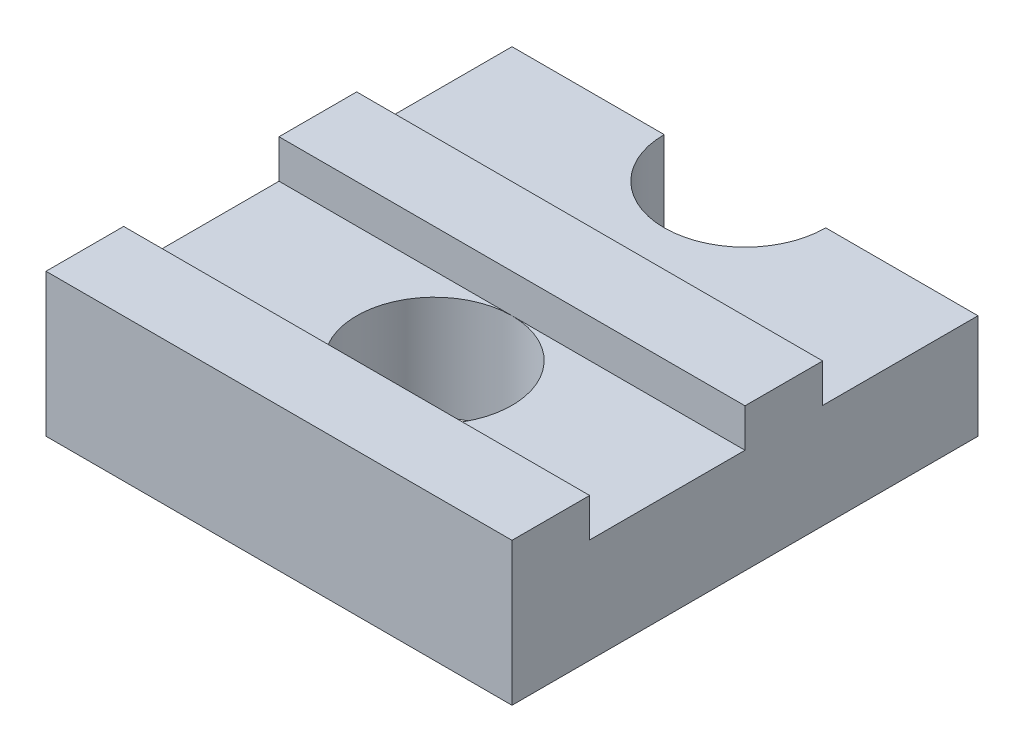
ISO-10303-21;
HEADER;
FILE_DESCRIPTION(('STEP AP214'),'2;1');
FILE_NAME('part.step','',(''),(''),'','','');
FILE_SCHEMA(('AUTOMOTIVE_DESIGN { 1 0 10303 214 1 1 1 1 }'));
ENDSEC;
DATA;
#1=APPLICATION_CONTEXT('core data for automotive mechanical design processes');
#2=APPLICATION_PROTOCOL_DEFINITION('international standard','automotive_design',2000,#1);
#3=PRODUCT_CONTEXT('',#1,'mechanical');
#4=PRODUCT('Part','Part','',(#3));
#5=PRODUCT_RELATED_PRODUCT_CATEGORY('part','',(#4));
#6=PRODUCT_DEFINITION_FORMATION('','',#4);
#7=PRODUCT_DEFINITION_CONTEXT('part definition',#1,'design');
#8=PRODUCT_DEFINITION('design','',#6,#7);
#9=PRODUCT_DEFINITION_SHAPE('','',#8);
#10=(LENGTH_UNIT() NAMED_UNIT(*) SI_UNIT(.MILLI.,.METRE.));
#11=(NAMED_UNIT(*) PLANE_ANGLE_UNIT() SI_UNIT($,.RADIAN.));
#12=(NAMED_UNIT(*) SI_UNIT($,.STERADIAN.) SOLID_ANGLE_UNIT());
#13=UNCERTAINTY_MEASURE_WITH_UNIT(LENGTH_MEASURE(1.E-05),#10,'distance_accuracy_value','');
#14=(GEOMETRIC_REPRESENTATION_CONTEXT(3) GLOBAL_UNCERTAINTY_ASSIGNED_CONTEXT((#13)) GLOBAL_UNIT_ASSIGNED_CONTEXT((#10,
#11,#12)) REPRESENTATION_CONTEXT('',''));
#15=CARTESIAN_POINT('',(0.,0.,0.));
#16=DIRECTION('',(0.,0.,1.));
#17=DIRECTION('',(1.,0.,0.));
#18=AXIS2_PLACEMENT_3D('',#15,#16,#17);
#19=CARTESIAN_POINT('',(4.7625,2.921,-4.7625));
#20=DIRECTION('',(0.,0.,1.));
#21=DIRECTION('',(1.,0.,0.));
#22=AXIS2_PLACEMENT_3D('',#19,#20,#21);
#23=PLANE('',#22);
#24=DIRECTION('',(-1.,0.,0.));
#25=VECTOR('',#24,1.);
#26=CARTESIAN_POINT('',(4.7625,0.,-4.7625));
#27=LINE('',#26,#25);
#28=CARTESIAN_POINT('',(4.7625,0.,-4.7625));
#29=VERTEX_POINT('',#28);
#30=CARTESIAN_POINT('',(1.651,0.,-4.7625));
#31=VERTEX_POINT('',#30);
#32=EDGE_CURVE('E139',#29,#31,#27,.T.);
#33=ORIENTED_EDGE('',*,*,#32,.T.);
#34=DIRECTION('',(0.,1.,0.));
#35=VECTOR('',#34,1.);
#36=CARTESIAN_POINT('',(1.651,0.,-4.7625));
#37=LINE('',#36,#35);
#38=CARTESIAN_POINT('',(1.651,2.1336,-4.7625));
#39=VERTEX_POINT('',#38);
#40=EDGE_CURVE('E124',#31,#39,#37,.T.);
#41=ORIENTED_EDGE('',*,*,#40,.T.);
#42=DIRECTION('',(-1.,0.,0.));
#43=VECTOR('',#42,1.);
#44=CARTESIAN_POINT('',(4.7625,2.1336,-4.7625));
#45=LINE('',#44,#43);
#46=CARTESIAN_POINT('',(4.7625,2.1336,-4.7625));
#47=VERTEX_POINT('',#46);
#48=EDGE_CURVE('E189',#47,#39,#45,.T.);
#49=ORIENTED_EDGE('',*,*,#48,.F.);
#50=DIRECTION('',(0.,-1.,0.));
#51=VECTOR('',#50,1.);
#52=CARTESIAN_POINT('',(4.7625,2.921,-4.7625));
#53=LINE('',#52,#51);
#54=EDGE_CURVE('E144',#47,#29,#53,.T.);
#55=ORIENTED_EDGE('',*,*,#54,.T.);
#56=EDGE_LOOP('',(#33,#41,#49,#55));
#57=FACE_BOUND('',#56,.T.);
#58=ADVANCED_FACE('F32',(#57),#23,.F.);
#59=CARTESIAN_POINT('',(0.,2.1336,0.));
#60=DIRECTION('',(0.,1.,0.));
#61=DIRECTION('',(0.,0.,1.));
#62=AXIS2_PLACEMENT_3D('',#59,#60,#61);
#63=PLANE('',#62);
#64=CARTESIAN_POINT('',(0.,2.1336,1.5875));
#65=DIRECTION('',(0.,1.,0.));
#66=DIRECTION('',(0.,0.,1.));
#67=AXIS2_PLACEMENT_3D('',#64,#65,#66);
#68=CIRCLE('',#67,1.5875);
#69=CARTESIAN_POINT('',(0.,2.1336,3.175));
#70=VERTEX_POINT('',#69);
#71=CARTESIAN_POINT('',(0.,2.1336,0.));
#72=VERTEX_POINT('',#71);
#73=EDGE_CURVE('E53',#70,#72,#68,.T.);
#74=ORIENTED_EDGE('',*,*,#73,.F.);
#75=DIRECTION('',(1.,0.,0.));
#76=VECTOR('',#75,1.);
#77=CARTESIAN_POINT('',(4.7625,2.1336,3.175));
#78=LINE('',#77,#76);
#79=CARTESIAN_POINT('',(4.7625,2.1336,3.175));
#80=VERTEX_POINT('',#79);
#81=EDGE_CURVE('E225',#70,#80,#78,.T.);
#82=ORIENTED_EDGE('',*,*,#81,.T.);
#83=DIRECTION('',(0.,0.,-1.));
#84=VECTOR('',#83,1.);
#85=CARTESIAN_POINT('',(4.7625,2.1336,3.175));
#86=LINE('',#85,#84);
#87=CARTESIAN_POINT('',(4.7625,2.1336,0.));
#88=VERTEX_POINT('',#87);
#89=EDGE_CURVE('E220',#80,#88,#86,.T.);
#90=ORIENTED_EDGE('',*,*,#89,.T.);
#91=DIRECTION('',(-1.,0.,0.));
#92=VECTOR('',#91,1.);
#93=CARTESIAN_POINT('',(4.7625,2.1336,0.));
#94=LINE('',#93,#92);
#95=EDGE_CURVE('E209',#88,#72,#94,.T.);
#96=ORIENTED_EDGE('',*,*,#95,.T.);
#97=EDGE_LOOP('',(#74,#82,#90,#96));
#98=FACE_BOUND('',#97,.T.);
#99=ADVANCED_FACE('F247',(#98),#63,.T.);
#100=CARTESIAN_POINT('',(-1.651,2.1336,-4.7625));
#101=VERTEX_POINT('',#100);
#102=CARTESIAN_POINT('',(-4.7625,2.1336,-4.7625));
#103=VERTEX_POINT('',#102);
#104=EDGE_CURVE('E198',#101,#103,#45,.T.);
#105=ORIENTED_EDGE('',*,*,#104,.F.);
#106=DIRECTION('',(0.,1.,0.));
#107=VECTOR('',#106,1.);
#108=CARTESIAN_POINT('',(-1.651,0.,-4.7625));
#109=LINE('',#108,#107);
#110=CARTESIAN_POINT('',(-1.651,0.,-4.7625));
#111=VERTEX_POINT('',#110);
#112=EDGE_CURVE('E47',#111,#101,#109,.T.);
#113=ORIENTED_EDGE('',*,*,#112,.F.);
#114=CARTESIAN_POINT('',(-4.7625,0.,-4.7625));
#115=VERTEX_POINT('',#114);
#116=EDGE_CURVE('E141',#111,#115,#27,.T.);
#117=ORIENTED_EDGE('',*,*,#116,.T.);
#118=DIRECTION('',(0.,-1.,0.));
#119=VECTOR('',#118,1.);
#120=CARTESIAN_POINT('',(-4.7625,2.921,-4.7625));
#121=LINE('',#120,#119);
#122=EDGE_CURVE('E154',#103,#115,#121,.T.);
#123=ORIENTED_EDGE('',*,*,#122,.F.);
#124=EDGE_LOOP('',(#105,#113,#117,#123));
#125=FACE_BOUND('',#124,.T.);
#126=ADVANCED_FACE('F250',(#125),#23,.F.);
#127=CARTESIAN_POINT('',(0.,2.921,0.));
#128=DIRECTION('',(0.,1.,0.));
#129=DIRECTION('',(0.,0.,1.));
#130=AXIS2_PLACEMENT_3D('',#127,#128,#129);
#131=PLANE('',#130);
#132=DIRECTION('',(-1.,0.,0.));
#133=VECTOR('',#132,1.);
#134=CARTESIAN_POINT('',(4.7625,2.921,0.));
#135=LINE('',#134,#133);
#136=CARTESIAN_POINT('',(4.7625,2.921,0.));
#137=VERTEX_POINT('',#136);
#138=CARTESIAN_POINT('',(-4.7625,2.921,0.));
#139=VERTEX_POINT('',#138);
#140=EDGE_CURVE('E213',#137,#139,#135,.T.);
#141=ORIENTED_EDGE('',*,*,#140,.F.);
#142=DIRECTION('',(0.,0.,-1.));
#143=VECTOR('',#142,1.);
#144=CARTESIAN_POINT('',(4.7625,2.921,4.7625));
#145=LINE('',#144,#143);
#146=CARTESIAN_POINT('',(4.7625,2.921,-1.5875));
#147=VERTEX_POINT('',#146);
#148=EDGE_CURVE('E184',#137,#147,#145,.T.);
#149=ORIENTED_EDGE('',*,*,#148,.T.);
#150=DIRECTION('',(1.,0.,0.));
#151=VECTOR('',#150,1.);
#152=CARTESIAN_POINT('',(4.7625,2.921,-1.5875));
#153=LINE('',#152,#151);
#154=CARTESIAN_POINT('',(-4.7625,2.921,-1.5875));
#155=VERTEX_POINT('',#154);
#156=EDGE_CURVE('E193',#155,#147,#153,.T.);
#157=ORIENTED_EDGE('',*,*,#156,.F.);
#158=DIRECTION('',(0.,0.,1.));
#159=VECTOR('',#158,1.);
#160=CARTESIAN_POINT('',(-4.7625,2.921,4.7625));
#161=LINE('',#160,#159);
#162=EDGE_CURVE('E148',#155,#139,#161,.T.);
#163=ORIENTED_EDGE('',*,*,#162,.T.);
#164=EDGE_LOOP('',(#141,#149,#157,#163));
#165=FACE_BOUND('',#164,.T.);
#166=ADVANCED_FACE('F258',(#165),#131,.T.);
#167=CARTESIAN_POINT('',(-4.7625,2.921,4.7625));
#168=DIRECTION('',(1.,0.,0.));
#169=DIRECTION('',(0.,0.,-1.));
#170=AXIS2_PLACEMENT_3D('',#167,#168,#169);
#171=PLANE('',#170);
#172=DIRECTION('',(0.,0.,1.));
#173=VECTOR('',#172,1.);
#174=CARTESIAN_POINT('',(-4.7625,2.1336,3.175));
#175=LINE('',#174,#173);
#176=CARTESIAN_POINT('',(-4.7625,2.1336,0.));
#177=VERTEX_POINT('',#176);
#178=CARTESIAN_POINT('',(-4.7625,2.1336,3.175));
#179=VERTEX_POINT('',#178);
#180=EDGE_CURVE('E215',#177,#179,#175,.T.);
#181=ORIENTED_EDGE('',*,*,#180,.F.);
#182=DIRECTION('',(0.,1.,0.));
#183=VECTOR('',#182,1.);
#184=CARTESIAN_POINT('',(-4.7625,2.1336,0.));
#185=LINE('',#184,#183);
#186=EDGE_CURVE('E176',#177,#139,#185,.T.);
#187=ORIENTED_EDGE('',*,*,#186,.T.);
#188=ORIENTED_EDGE('',*,*,#162,.F.);
#189=DIRECTION('',(0.,1.,0.));
#190=VECTOR('',#189,1.);
#191=CARTESIAN_POINT('',(-4.7625,2.1336,-1.5875));
#192=LINE('',#191,#190);
#193=CARTESIAN_POINT('',(-4.7625,2.1336,-1.5875));
#194=VERTEX_POINT('',#193);
#195=EDGE_CURVE('E186',#194,#155,#192,.T.);
#196=ORIENTED_EDGE('',*,*,#195,.F.);
#197=DIRECTION('',(0.,0.,1.));
#198=VECTOR('',#197,1.);
#199=CARTESIAN_POINT('',(-4.7625,2.1336,-1.5875));
#200=LINE('',#199,#198);
#201=EDGE_CURVE('E195',#103,#194,#200,.T.);
#202=ORIENTED_EDGE('',*,*,#201,.F.);
#203=ORIENTED_EDGE('',*,*,#122,.T.);
#204=DIRECTION('',(0.,0.,1.));
#205=VECTOR('',#204,1.);
#206=CARTESIAN_POINT('',(-4.7625,0.,4.7625));
#207=LINE('',#206,#205);
#208=CARTESIAN_POINT('',(-4.7625,0.,4.7625));
#209=VERTEX_POINT('',#208);
#210=EDGE_CURVE('E172',#115,#209,#207,.T.);
#211=ORIENTED_EDGE('',*,*,#210,.T.);
#212=DIRECTION('',(0.,-1.,0.));
#213=VECTOR('',#212,1.);
#214=CARTESIAN_POINT('',(-4.7625,2.921,4.7625));
#215=LINE('',#214,#213);
#216=CARTESIAN_POINT('',(-4.7625,2.921,4.7625));
#217=VERTEX_POINT('',#216);
#218=EDGE_CURVE('E40',#217,#209,#215,.T.);
#219=ORIENTED_EDGE('',*,*,#218,.F.);
#220=CARTESIAN_POINT('',(-4.7625,2.921,3.175));
#221=VERTEX_POINT('',#220);
#222=EDGE_CURVE('E146',#221,#217,#161,.T.);
#223=ORIENTED_EDGE('',*,*,#222,.F.);
#224=DIRECTION('',(0.,1.,0.));
#225=VECTOR('',#224,1.);
#226=CARTESIAN_POINT('',(-4.7625,2.1336,3.175));
#227=LINE('',#226,#225);
#228=EDGE_CURVE('E206',#179,#221,#227,.T.);
#229=ORIENTED_EDGE('',*,*,#228,.F.);
#230=EDGE_LOOP('',(#181,#187,#188,#196,#202,#203,#211,#219,#223,#229));
#231=FACE_BOUND('',#230,.T.);
#232=ADVANCED_FACE('F34',(#231),#171,.F.);
#233=CARTESIAN_POINT('',(4.7625,2.921,4.7625));
#234=DIRECTION('',(0.,0.,-1.));
#235=DIRECTION('',(-1.,0.,0.));
#236=AXIS2_PLACEMENT_3D('',#233,#234,#235);
#237=PLANE('',#236);
#238=DIRECTION('',(1.,0.,0.));
#239=VECTOR('',#238,1.);
#240=CARTESIAN_POINT('',(4.7625,0.,4.7625));
#241=LINE('',#240,#239);
#242=CARTESIAN_POINT('',(4.7625,0.,4.7625));
#243=VERTEX_POINT('',#242);
#244=EDGE_CURVE('E168',#209,#243,#241,.T.);
#245=ORIENTED_EDGE('',*,*,#244,.T.);
#246=DIRECTION('',(0.,-1.,0.));
#247=VECTOR('',#246,1.);
#248=CARTESIAN_POINT('',(4.7625,2.921,4.7625));
#249=LINE('',#248,#247);
#250=CARTESIAN_POINT('',(4.7625,2.921,4.7625));
#251=VERTEX_POINT('',#250);
#252=EDGE_CURVE('E159',#251,#243,#249,.T.);
#253=ORIENTED_EDGE('',*,*,#252,.F.);
#254=DIRECTION('',(1.,0.,0.));
#255=VECTOR('',#254,1.);
#256=CARTESIAN_POINT('',(4.7625,2.921,4.7625));
#257=LINE('',#256,#255);
#258=EDGE_CURVE('E169',#217,#251,#257,.T.);
#259=ORIENTED_EDGE('',*,*,#258,.F.);
#260=ORIENTED_EDGE('',*,*,#218,.T.);
#261=EDGE_LOOP('',(#245,#253,#259,#260));
#262=FACE_BOUND('',#261,.T.);
#263=ADVANCED_FACE('F166',(#262),#237,.F.);
#264=CARTESIAN_POINT('',(4.7625,2.921,4.7625));
#265=DIRECTION('',(-1.,0.,0.));
#266=DIRECTION('',(0.,0.,1.));
#267=AXIS2_PLACEMENT_3D('',#264,#265,#266);
#268=PLANE('',#267);
#269=ORIENTED_EDGE('',*,*,#148,.F.);
#270=DIRECTION('',(0.,1.,0.));
#271=VECTOR('',#270,1.);
#272=CARTESIAN_POINT('',(4.7625,2.1336,0.));
#273=LINE('',#272,#271);
#274=EDGE_CURVE('E179',#88,#137,#273,.T.);
#275=ORIENTED_EDGE('',*,*,#274,.F.);
#276=ORIENTED_EDGE('',*,*,#89,.F.);
#277=DIRECTION('',(0.,1.,0.));
#278=VECTOR('',#277,1.);
#279=CARTESIAN_POINT('',(4.7625,2.1336,3.175));
#280=LINE('',#279,#278);
#281=CARTESIAN_POINT('',(4.7625,2.921,3.175));
#282=VERTEX_POINT('',#281);
#283=EDGE_CURVE('E208',#80,#282,#280,.T.);
#284=ORIENTED_EDGE('',*,*,#283,.T.);
#285=EDGE_CURVE('E157',#251,#282,#145,.T.);
#286=ORIENTED_EDGE('',*,*,#285,.F.);
#287=ORIENTED_EDGE('',*,*,#252,.T.);
#288=DIRECTION('',(0.,0.,-1.));
#289=VECTOR('',#288,1.);
#290=CARTESIAN_POINT('',(4.7625,0.,4.7625));
#291=LINE('',#290,#289);
#292=EDGE_CURVE('E150',#243,#29,#291,.T.);
#293=ORIENTED_EDGE('',*,*,#292,.T.);
#294=ORIENTED_EDGE('',*,*,#54,.F.);
#295=DIRECTION('',(0.,0.,-1.));
#296=VECTOR('',#295,1.);
#297=CARTESIAN_POINT('',(4.7625,2.1336,-1.5875));
#298=LINE('',#297,#296);
#299=CARTESIAN_POINT('',(4.7625,2.1336,-1.5875));
#300=VERTEX_POINT('',#299);
#301=EDGE_CURVE('E199',#300,#47,#298,.T.);
#302=ORIENTED_EDGE('',*,*,#301,.F.);
#303=DIRECTION('',(0.,1.,0.));
#304=VECTOR('',#303,1.);
#305=CARTESIAN_POINT('',(4.7625,2.1336,-1.5875));
#306=LINE('',#305,#304);
#307=EDGE_CURVE('E188',#300,#147,#306,.T.);
#308=ORIENTED_EDGE('',*,*,#307,.T.);
#309=EDGE_LOOP('',(#269,#275,#276,#284,#286,#287,#293,#294,#302,#308));
#310=FACE_BOUND('',#309,.T.);
#311=ADVANCED_FACE('F280',(#310),#268,.F.);
#312=DIRECTION('',(1.,0.,0.));
#313=VECTOR('',#312,1.);
#314=CARTESIAN_POINT('',(4.7625,2.921,3.175));
#315=LINE('',#314,#313);
#316=EDGE_CURVE('E192',#221,#282,#315,.T.);
#317=ORIENTED_EDGE('',*,*,#316,.F.);
#318=ORIENTED_EDGE('',*,*,#222,.T.);
#319=ORIENTED_EDGE('',*,*,#258,.T.);
#320=ORIENTED_EDGE('',*,*,#285,.T.);
#321=EDGE_LOOP('',(#317,#318,#319,#320));
#322=FACE_BOUND('',#321,.T.);
#323=ADVANCED_FACE('F265',(#322),#131,.T.);
#324=CARTESIAN_POINT('',(0.,0.,0.));
#325=DIRECTION('',(0.,1.,0.));
#326=DIRECTION('',(0.,0.,1.));
#327=AXIS2_PLACEMENT_3D('',#324,#325,#326);
#328=PLANE('',#327);
#329=CARTESIAN_POINT('',(0.,0.,1.5875));
#330=DIRECTION('',(0.,1.,0.));
#331=DIRECTION('',(0.,0.,1.));
#332=AXIS2_PLACEMENT_3D('',#329,#330,#331);
#333=CIRCLE('',#332,1.5875);
#334=CARTESIAN_POINT('',(0.,0.,3.175));
#335=VERTEX_POINT('',#334);
#336=EDGE_CURVE('E196',#335,#335,#333,.T.);
#337=ORIENTED_EDGE('',*,*,#336,.T.);
#338=EDGE_LOOP('',(#337));
#339=FACE_BOUND('',#338,.T.);
#340=ORIENTED_EDGE('',*,*,#116,.F.);
#341=CARTESIAN_POINT('',(0.,0.,-4.7625));
#342=DIRECTION('',(0.,1.,0.));
#343=DIRECTION('',(0.,0.,1.));
#344=AXIS2_PLACEMENT_3D('',#341,#342,#343);
#345=CIRCLE('',#344,1.651);
#346=EDGE_CURVE('E127',#111,#31,#345,.T.);
#347=ORIENTED_EDGE('',*,*,#346,.T.);
#348=ORIENTED_EDGE('',*,*,#32,.F.);
#349=ORIENTED_EDGE('',*,*,#292,.F.);
#350=ORIENTED_EDGE('',*,*,#244,.F.);
#351=ORIENTED_EDGE('',*,*,#210,.F.);
#352=EDGE_LOOP('',(#340,#347,#348,#349,#350,#351));
#353=FACE_BOUND('',#352,.T.);
#354=ADVANCED_FACE('F137',(#339,#353),#328,.F.);
#355=CARTESIAN_POINT('',(4.7625,2.1336,-1.5875));
#356=DIRECTION('',(0.,0.,1.));
#357=DIRECTION('',(1.,0.,0.));
#358=AXIS2_PLACEMENT_3D('',#355,#356,#357);
#359=PLANE('',#358);
#360=ORIENTED_EDGE('',*,*,#156,.T.);
#361=ORIENTED_EDGE('',*,*,#307,.F.);
#362=DIRECTION('',(1.,0.,0.));
#363=VECTOR('',#362,1.);
#364=CARTESIAN_POINT('',(4.7625,2.1336,-1.5875));
#365=LINE('',#364,#363);
#366=EDGE_CURVE('E201',#194,#300,#365,.T.);
#367=ORIENTED_EDGE('',*,*,#366,.F.);
#368=ORIENTED_EDGE('',*,*,#195,.T.);
#369=EDGE_LOOP('',(#360,#361,#367,#368));
#370=FACE_BOUND('',#369,.T.);
#371=ADVANCED_FACE('F274',(#370),#359,.F.);
#372=CARTESIAN_POINT('',(0.,2.1336,0.));
#373=DIRECTION('',(0.,1.,0.));
#374=DIRECTION('',(0.,0.,1.));
#375=AXIS2_PLACEMENT_3D('',#372,#373,#374);
#376=PLANE('',#375);
#377=CARTESIAN_POINT('',(0.,2.1336,-4.7625));
#378=DIRECTION('',(0.,1.,0.));
#379=DIRECTION('',(0.,0.,1.));
#380=AXIS2_PLACEMENT_3D('',#377,#378,#379);
#381=CIRCLE('',#380,1.651);
#382=EDGE_CURVE('E128',#101,#39,#381,.T.);
#383=ORIENTED_EDGE('',*,*,#382,.F.);
#384=ORIENTED_EDGE('',*,*,#104,.T.);
#385=ORIENTED_EDGE('',*,*,#201,.T.);
#386=ORIENTED_EDGE('',*,*,#366,.T.);
#387=ORIENTED_EDGE('',*,*,#301,.T.);
#388=ORIENTED_EDGE('',*,*,#48,.T.);
#389=EDGE_LOOP('',(#383,#384,#385,#386,#387,#388));
#390=FACE_BOUND('',#389,.T.);
#391=ADVANCED_FACE('F268',(#390),#376,.T.);
#392=CARTESIAN_POINT('',(4.7625,2.1336,0.));
#393=DIRECTION('',(0.,0.,-1.));
#394=DIRECTION('',(-1.,0.,0.));
#395=AXIS2_PLACEMENT_3D('',#392,#393,#394);
#396=PLANE('',#395);
#397=ORIENTED_EDGE('',*,*,#140,.T.);
#398=ORIENTED_EDGE('',*,*,#186,.F.);
#399=EDGE_CURVE('E219',#72,#177,#94,.T.);
#400=ORIENTED_EDGE('',*,*,#399,.F.);
#401=ORIENTED_EDGE('',*,*,#95,.F.);
#402=ORIENTED_EDGE('',*,*,#274,.T.);
#403=EDGE_LOOP('',(#397,#398,#400,#401,#402));
#404=FACE_BOUND('',#403,.T.);
#405=ADVANCED_FACE('F294',(#404),#396,.F.);
#406=CARTESIAN_POINT('',(4.7625,2.1336,3.175));
#407=DIRECTION('',(0.,0.,1.));
#408=DIRECTION('',(1.,0.,0.));
#409=AXIS2_PLACEMENT_3D('',#406,#407,#408);
#410=PLANE('',#409);
#411=ORIENTED_EDGE('',*,*,#316,.T.);
#412=ORIENTED_EDGE('',*,*,#283,.F.);
#413=ORIENTED_EDGE('',*,*,#81,.F.);
#414=EDGE_CURVE('E222',#179,#70,#78,.T.);
#415=ORIENTED_EDGE('',*,*,#414,.F.);
#416=ORIENTED_EDGE('',*,*,#228,.T.);
#417=EDGE_LOOP('',(#411,#412,#413,#415,#416));
#418=FACE_BOUND('',#417,.T.);
#419=ADVANCED_FACE('F244',(#418),#410,.F.);
#420=CARTESIAN_POINT('',(0.,2.1336,1.5875));
#421=DIRECTION('',(0.,1.,0.));
#422=DIRECTION('',(0.,0.,1.));
#423=AXIS2_PLACEMENT_3D('',#420,#421,#422);
#424=CIRCLE('',#423,1.5875);
#425=EDGE_CURVE('E11',#72,#70,#424,.T.);
#426=ORIENTED_EDGE('',*,*,#425,.F.);
#427=ORIENTED_EDGE('',*,*,#399,.T.);
#428=ORIENTED_EDGE('',*,*,#180,.T.);
#429=ORIENTED_EDGE('',*,*,#414,.T.);
#430=EDGE_LOOP('',(#426,#427,#428,#429));
#431=FACE_BOUND('',#430,.T.);
#432=ADVANCED_FACE('F237',(#431),#63,.T.);
#433=CARTESIAN_POINT('',(0.,0.,1.5875));
#434=DIRECTION('',(0.,1.,0.));
#435=DIRECTION('',(0.,0.,1.));
#436=AXIS2_PLACEMENT_3D('',#433,#434,#435);
#437=CYLINDRICAL_SURFACE('',#436,1.5875);
#438=ORIENTED_EDGE('',*,*,#336,.F.);
#439=EDGE_LOOP('',(#438));
#440=FACE_BOUND('',#439,.T.);
#441=ORIENTED_EDGE('',*,*,#73,.T.);
#442=ORIENTED_EDGE('',*,*,#425,.T.);
#443=EDGE_LOOP('',(#441,#442));
#444=FACE_BOUND('',#443,.T.);
#445=ADVANCED_FACE('F235',(#440,#444),#437,.F.);
#446=CARTESIAN_POINT('',(0.,0.,-4.7625));
#447=DIRECTION('',(0.,1.,0.));
#448=DIRECTION('',(0.,0.,1.));
#449=AXIS2_PLACEMENT_3D('',#446,#447,#448);
#450=CYLINDRICAL_SURFACE('',#449,1.651);
#451=ORIENTED_EDGE('',*,*,#382,.T.);
#452=ORIENTED_EDGE('',*,*,#40,.F.);
#453=ORIENTED_EDGE('',*,*,#346,.F.);
#454=ORIENTED_EDGE('',*,*,#112,.T.);
#455=EDGE_LOOP('',(#451,#452,#453,#454));
#456=FACE_BOUND('',#455,.T.);
#457=ADVANCED_FACE('F126',(#456),#450,.F.);
#458=CLOSED_SHELL('',(#58,#99,#126,#166,#232,#263,#311,#323,#354,#371,#391,#405,#419,#432,#445,#457));
#459=MANIFOLD_SOLID_BREP('B2',#458);
#460=ADVANCED_BREP_SHAPE_REPRESENTATION('',(#18,#459),#14);
#461=SHAPE_DEFINITION_REPRESENTATION(#9,#460);
ENDSEC;
END-ISO-10303-21;
